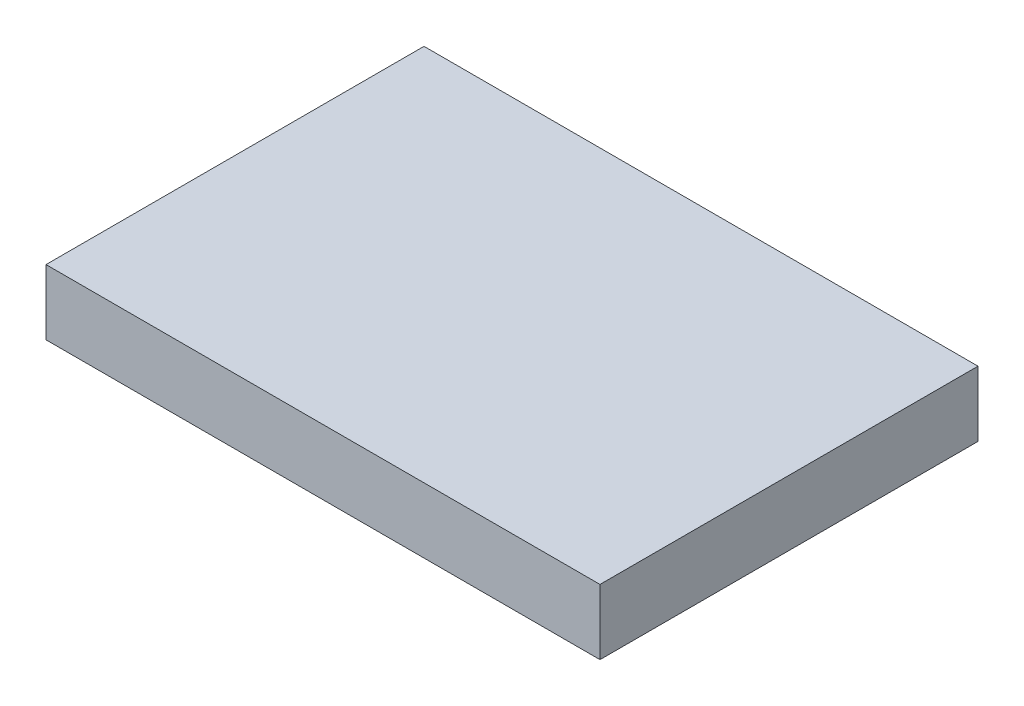
ISO-10303-21;
HEADER;
FILE_DESCRIPTION(('STEP AP214'),'2;1');
FILE_NAME('part.step','',(''),(''),'','','');
FILE_SCHEMA(('AUTOMOTIVE_DESIGN { 1 0 10303 214 1 1 1 1 }'));
ENDSEC;
DATA;
#1=APPLICATION_CONTEXT('core data for automotive mechanical design processes');
#2=APPLICATION_PROTOCOL_DEFINITION('international standard','automotive_design',2000,#1);
#3=PRODUCT_CONTEXT('',#1,'mechanical');
#4=PRODUCT('Part','Part','',(#3));
#5=PRODUCT_RELATED_PRODUCT_CATEGORY('part','',(#4));
#6=PRODUCT_DEFINITION_FORMATION('','',#4);
#7=PRODUCT_DEFINITION_CONTEXT('part definition',#1,'design');
#8=PRODUCT_DEFINITION('design','',#6,#7);
#9=PRODUCT_DEFINITION_SHAPE('','',#8);
#10=(LENGTH_UNIT() NAMED_UNIT(*) SI_UNIT(.MILLI.,.METRE.));
#11=(NAMED_UNIT(*) PLANE_ANGLE_UNIT() SI_UNIT($,.RADIAN.));
#12=(NAMED_UNIT(*) SI_UNIT($,.STERADIAN.) SOLID_ANGLE_UNIT());
#13=UNCERTAINTY_MEASURE_WITH_UNIT(LENGTH_MEASURE(1.E-05),#10,'distance_accuracy_value','');
#14=(GEOMETRIC_REPRESENTATION_CONTEXT(3) GLOBAL_UNCERTAINTY_ASSIGNED_CONTEXT((#13)) GLOBAL_UNIT_ASSIGNED_CONTEXT((#10,
#11,#12)) REPRESENTATION_CONTEXT('',''));
#15=CARTESIAN_POINT('',(0.,0.,0.));
#16=DIRECTION('',(0.,0.,1.));
#17=DIRECTION('',(1.,0.,0.));
#18=AXIS2_PLACEMENT_3D('',#15,#16,#17);
#19=CARTESIAN_POINT('',(-37.4844720496894,10.,-15.3985507246376));
#20=DIRECTION('',(1.,0.,0.));
#21=DIRECTION('',(0.,0.,-1.));
#22=AXIS2_PLACEMENT_3D('',#19,#20,#21);
#23=PLANE('',#22);
#24=DIRECTION('',(0.,0.,1.));
#25=VECTOR('',#24,1.);
#26=CARTESIAN_POINT('',(-37.4844720496894,0.,-15.3985507246376));
#27=LINE('',#26,#25);
#28=CARTESIAN_POINT('',(-37.4844720496894,0.,-15.3985507246376));
#29=VERTEX_POINT('',#28);
#30=CARTESIAN_POINT('',(-37.4844720496894,0.,42.6014492753624));
#31=VERTEX_POINT('',#30);
#32=EDGE_CURVE('E107',#29,#31,#27,.T.);
#33=ORIENTED_EDGE('',*,*,#32,.T.);
#34=DIRECTION('',(0.,-1.,0.));
#35=VECTOR('',#34,1.);
#36=CARTESIAN_POINT('',(-37.4844720496894,10.,42.6014492753624));
#37=LINE('',#36,#35);
#38=CARTESIAN_POINT('',(-37.4844720496894,10.,42.6014492753624));
#39=VERTEX_POINT('',#38);
#40=EDGE_CURVE('E11',#39,#31,#37,.T.);
#41=ORIENTED_EDGE('',*,*,#40,.F.);
#42=DIRECTION('',(0.,0.,1.));
#43=VECTOR('',#42,1.);
#44=CARTESIAN_POINT('',(-37.4844720496894,10.,-15.3985507246376));
#45=LINE('',#44,#43);
#46=CARTESIAN_POINT('',(-37.4844720496894,10.,-15.3985507246376));
#47=VERTEX_POINT('',#46);
#48=EDGE_CURVE('E91',#47,#39,#45,.T.);
#49=ORIENTED_EDGE('',*,*,#48,.F.);
#50=DIRECTION('',(0.,-1.,0.));
#51=VECTOR('',#50,1.);
#52=CARTESIAN_POINT('',(-37.4844720496894,10.,-15.3985507246376));
#53=LINE('',#52,#51);
#54=EDGE_CURVE('E103',#47,#29,#53,.T.);
#55=ORIENTED_EDGE('',*,*,#54,.T.);
#56=EDGE_LOOP('',(#33,#41,#49,#55));
#57=FACE_BOUND('',#56,.T.);
#58=ADVANCED_FACE('F39',(#57),#23,.F.);
#59=CARTESIAN_POINT('',(-37.4844720496894,10.,42.6014492753624));
#60=DIRECTION('',(0.,0.,-1.));
#61=DIRECTION('',(-1.,0.,0.));
#62=AXIS2_PLACEMENT_3D('',#59,#60,#61);
#63=PLANE('',#62);
#64=DIRECTION('',(1.,0.,0.));
#65=VECTOR('',#64,1.);
#66=CARTESIAN_POINT('',(-37.4844720496894,0.,42.6014492753624));
#67=LINE('',#66,#65);
#68=CARTESIAN_POINT('',(47.5155279503106,0.,42.6014492753624));
#69=VERTEX_POINT('',#68);
#70=EDGE_CURVE('E96',#31,#69,#67,.T.);
#71=ORIENTED_EDGE('',*,*,#70,.T.);
#72=DIRECTION('',(0.,-1.,0.));
#73=VECTOR('',#72,1.);
#74=CARTESIAN_POINT('',(47.5155279503106,10.,42.6014492753624));
#75=LINE('',#74,#73);
#76=CARTESIAN_POINT('',(47.5155279503106,10.,42.6014492753624));
#77=VERTEX_POINT('',#76);
#78=EDGE_CURVE('E48',#77,#69,#75,.T.);
#79=ORIENTED_EDGE('',*,*,#78,.F.);
#80=DIRECTION('',(1.,0.,0.));
#81=VECTOR('',#80,1.);
#82=CARTESIAN_POINT('',(-37.4844720496894,10.,42.6014492753624));
#83=LINE('',#82,#81);
#84=EDGE_CURVE('E86',#39,#77,#83,.T.);
#85=ORIENTED_EDGE('',*,*,#84,.F.);
#86=ORIENTED_EDGE('',*,*,#40,.T.);
#87=EDGE_LOOP('',(#71,#79,#85,#86));
#88=FACE_BOUND('',#87,.T.);
#89=ADVANCED_FACE('F95',(#88),#63,.F.);
#90=CARTESIAN_POINT('',(47.5155279503106,10.,-15.3985507246376));
#91=DIRECTION('',(-1.,0.,0.));
#92=DIRECTION('',(0.,0.,1.));
#93=AXIS2_PLACEMENT_3D('',#90,#91,#92);
#94=PLANE('',#93);
#95=DIRECTION('',(0.,0.,-1.));
#96=VECTOR('',#95,1.);
#97=CARTESIAN_POINT('',(47.5155279503106,0.,-15.3985507246376));
#98=LINE('',#97,#96);
#99=CARTESIAN_POINT('',(47.5155279503106,0.,-15.3985507246376));
#100=VERTEX_POINT('',#99);
#101=EDGE_CURVE('E73',#69,#100,#98,.T.);
#102=ORIENTED_EDGE('',*,*,#101,.T.);
#103=DIRECTION('',(0.,-1.,0.));
#104=VECTOR('',#103,1.);
#105=CARTESIAN_POINT('',(47.5155279503106,10.,-15.3985507246376));
#106=LINE('',#105,#104);
#107=CARTESIAN_POINT('',(47.5155279503106,10.,-15.3985507246376));
#108=VERTEX_POINT('',#107);
#109=EDGE_CURVE('E98',#108,#100,#106,.T.);
#110=ORIENTED_EDGE('',*,*,#109,.F.);
#111=DIRECTION('',(0.,0.,-1.));
#112=VECTOR('',#111,1.);
#113=CARTESIAN_POINT('',(47.5155279503106,10.,-15.3985507246376));
#114=LINE('',#113,#112);
#115=EDGE_CURVE('E89',#77,#108,#114,.T.);
#116=ORIENTED_EDGE('',*,*,#115,.F.);
#117=ORIENTED_EDGE('',*,*,#78,.T.);
#118=EDGE_LOOP('',(#102,#110,#116,#117));
#119=FACE_BOUND('',#118,.T.);
#120=ADVANCED_FACE('F99',(#119),#94,.F.);
#121=CARTESIAN_POINT('',(-37.4844720496894,10.,-15.3985507246376));
#122=DIRECTION('',(0.,0.,1.));
#123=DIRECTION('',(1.,0.,0.));
#124=AXIS2_PLACEMENT_3D('',#121,#122,#123);
#125=PLANE('',#124);
#126=DIRECTION('',(-1.,0.,0.));
#127=VECTOR('',#126,1.);
#128=CARTESIAN_POINT('',(-37.4844720496894,0.,-15.3985507246376));
#129=LINE('',#128,#127);
#130=EDGE_CURVE('E79',#100,#29,#129,.T.);
#131=ORIENTED_EDGE('',*,*,#130,.T.);
#132=ORIENTED_EDGE('',*,*,#54,.F.);
#133=DIRECTION('',(-1.,0.,0.));
#134=VECTOR('',#133,1.);
#135=CARTESIAN_POINT('',(-37.4844720496894,10.,-15.3985507246376));
#136=LINE('',#135,#134);
#137=EDGE_CURVE('E56',#108,#47,#136,.T.);
#138=ORIENTED_EDGE('',*,*,#137,.F.);
#139=ORIENTED_EDGE('',*,*,#109,.T.);
#140=EDGE_LOOP('',(#131,#132,#138,#139));
#141=FACE_BOUND('',#140,.T.);
#142=ADVANCED_FACE('F120',(#141),#125,.F.);
#143=CARTESIAN_POINT('',(0.,10.,0.));
#144=DIRECTION('',(0.,1.,0.));
#145=DIRECTION('',(0.,0.,1.));
#146=AXIS2_PLACEMENT_3D('',#143,#144,#145);
#147=PLANE('',#146);
#148=ORIENTED_EDGE('',*,*,#48,.T.);
#149=ORIENTED_EDGE('',*,*,#84,.T.);
#150=ORIENTED_EDGE('',*,*,#115,.T.);
#151=ORIENTED_EDGE('',*,*,#137,.T.);
#152=EDGE_LOOP('',(#148,#149,#150,#151));
#153=FACE_BOUND('',#152,.T.);
#154=ADVANCED_FACE('F87',(#153),#147,.T.);
#155=CARTESIAN_POINT('',(0.,0.,0.));
#156=DIRECTION('',(0.,1.,0.));
#157=DIRECTION('',(0.,0.,1.));
#158=AXIS2_PLACEMENT_3D('',#155,#156,#157);
#159=PLANE('',#158);
#160=ORIENTED_EDGE('',*,*,#32,.F.);
#161=ORIENTED_EDGE('',*,*,#130,.F.);
#162=ORIENTED_EDGE('',*,*,#101,.F.);
#163=ORIENTED_EDGE('',*,*,#70,.F.);
#164=EDGE_LOOP('',(#160,#161,#162,#163));
#165=FACE_BOUND('',#164,.T.);
#166=ADVANCED_FACE('F123',(#165),#159,.F.);
#167=CLOSED_SHELL('',(#58,#89,#120,#142,#154,#166));
#168=MANIFOLD_SOLID_BREP('B2',#167);
#169=ADVANCED_BREP_SHAPE_REPRESENTATION('',(#18,#168),#14);
#170=SHAPE_DEFINITION_REPRESENTATION(#9,#169);
ENDSEC;
END-ISO-10303-21;
